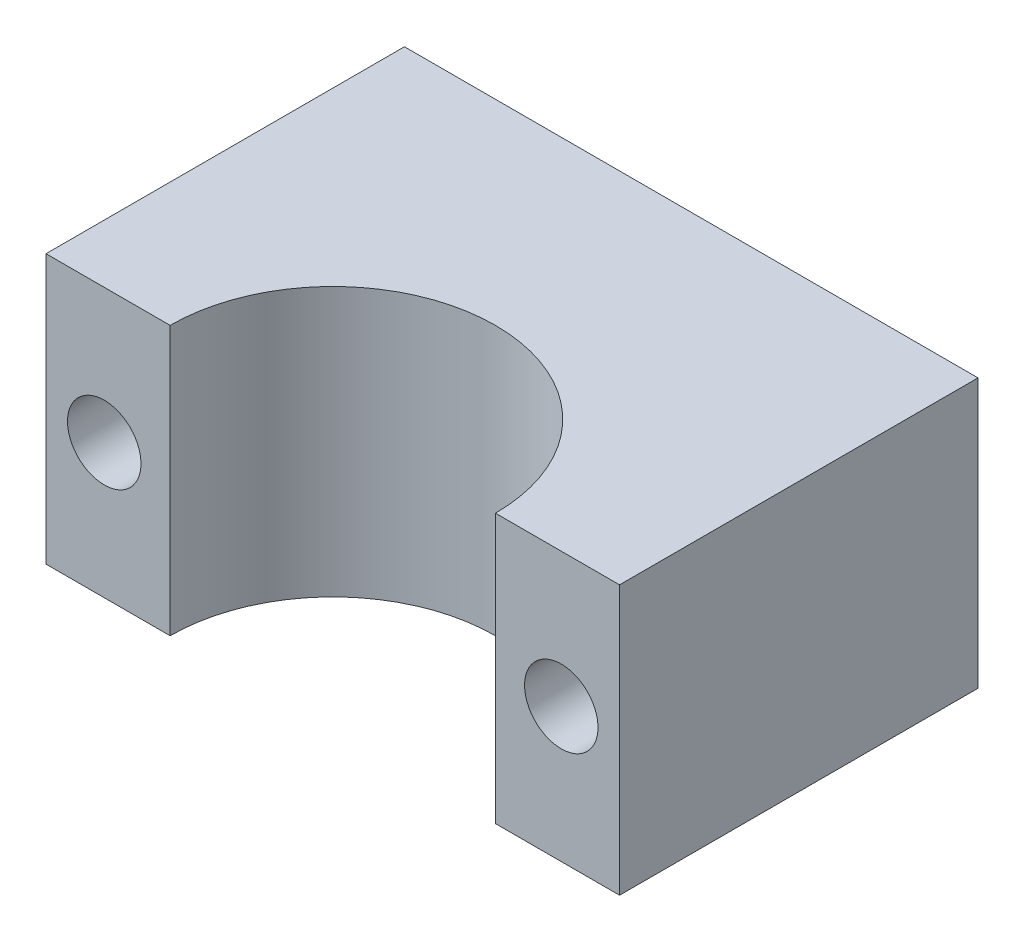
ISO-10303-21;
HEADER;
FILE_DESCRIPTION(('STEP AP214'),'2;1');
FILE_NAME('part.step','',(''),(''),'','','');
FILE_SCHEMA(('AUTOMOTIVE_DESIGN { 1 0 10303 214 1 1 1 1 }'));
ENDSEC;
DATA;
#1=APPLICATION_CONTEXT('core data for automotive mechanical design processes');
#2=APPLICATION_PROTOCOL_DEFINITION('international standard','automotive_design',2000,#1);
#3=PRODUCT_CONTEXT('',#1,'mechanical');
#4=PRODUCT('Part','Part','',(#3));
#5=PRODUCT_RELATED_PRODUCT_CATEGORY('part','',(#4));
#6=PRODUCT_DEFINITION_FORMATION('','',#4);
#7=PRODUCT_DEFINITION_CONTEXT('part definition',#1,'design');
#8=PRODUCT_DEFINITION('design','',#6,#7);
#9=PRODUCT_DEFINITION_SHAPE('','',#8);
#10=(LENGTH_UNIT() NAMED_UNIT(*) SI_UNIT(.MILLI.,.METRE.));
#11=(NAMED_UNIT(*) PLANE_ANGLE_UNIT() SI_UNIT($,.RADIAN.));
#12=(NAMED_UNIT(*) SI_UNIT($,.STERADIAN.) SOLID_ANGLE_UNIT());
#13=UNCERTAINTY_MEASURE_WITH_UNIT(LENGTH_MEASURE(1.E-05),#10,'distance_accuracy_value','');
#14=(GEOMETRIC_REPRESENTATION_CONTEXT(3) GLOBAL_UNCERTAINTY_ASSIGNED_CONTEXT((#13)) GLOBAL_UNIT_ASSIGNED_CONTEXT((#10,
#11,#12)) REPRESENTATION_CONTEXT('',''));
#15=CARTESIAN_POINT('',(0.,0.,0.));
#16=DIRECTION('',(0.,0.,1.));
#17=DIRECTION('',(1.,0.,0.));
#18=AXIS2_PLACEMENT_3D('',#15,#16,#17);
#19=CARTESIAN_POINT('',(-16.,15.,-20.));
#20=DIRECTION('',(0.,0.,1.));
#21=DIRECTION('',(1.,0.,0.));
#22=AXIS2_PLACEMENT_3D('',#19,#20,#21);
#23=PLANE('',#22);
#24=DIRECTION('',(-1.,0.,0.));
#25=VECTOR('',#24,1.);
#26=CARTESIAN_POINT('',(-16.,0.,-20.));
#27=LINE('',#26,#25);
#28=CARTESIAN_POINT('',(16.,0.,-20.));
#29=VERTEX_POINT('',#28);
#30=CARTESIAN_POINT('',(-16.,0.,-20.));
#31=VERTEX_POINT('',#30);
#32=EDGE_CURVE('E167',#29,#31,#27,.T.);
#33=ORIENTED_EDGE('',*,*,#32,.T.);
#34=DIRECTION('',(0.,-1.,0.));
#35=VECTOR('',#34,1.);
#36=CARTESIAN_POINT('',(-16.,15.,-20.));
#37=LINE('',#36,#35);
#38=CARTESIAN_POINT('',(-16.,15.,-20.));
#39=VERTEX_POINT('',#38);
#40=EDGE_CURVE('E148',#39,#31,#37,.T.);
#41=ORIENTED_EDGE('',*,*,#40,.F.);
#42=DIRECTION('',(-1.,0.,0.));
#43=VECTOR('',#42,1.);
#44=CARTESIAN_POINT('',(-16.,15.,-20.));
#45=LINE('',#44,#43);
#46=CARTESIAN_POINT('',(16.,15.,-20.));
#47=VERTEX_POINT('',#46);
#48=EDGE_CURVE('E135',#47,#39,#45,.T.);
#49=ORIENTED_EDGE('',*,*,#48,.F.);
#50=DIRECTION('',(0.,-1.,0.));
#51=VECTOR('',#50,1.);
#52=CARTESIAN_POINT('',(16.,15.,-20.));
#53=LINE('',#52,#51);
#54=EDGE_CURVE('E59',#47,#29,#53,.T.);
#55=ORIENTED_EDGE('',*,*,#54,.T.);
#56=EDGE_LOOP('',(#33,#41,#49,#55));
#57=FACE_BOUND('',#56,.T.);
#58=CARTESIAN_POINT('',(-12.75,7.5,-20.000012));
#59=DIRECTION('',(0.,0.,-1.));
#60=DIRECTION('',(-1.,0.,0.));
#61=AXIS2_PLACEMENT_3D('',#58,#59,#60);
#62=CIRCLE('',#61,2.05);
#63=CARTESIAN_POINT('',(-14.8,7.5,-20.000012));
#64=VERTEX_POINT('',#63);
#65=EDGE_CURVE('E188',#64,#64,#62,.T.);
#66=ORIENTED_EDGE('',*,*,#65,.F.);
#67=EDGE_LOOP('',(#66));
#68=FACE_BOUND('',#67,.T.);
#69=CARTESIAN_POINT('',(12.75,7.5,-20.000012));
#70=DIRECTION('',(0.,0.,-1.));
#71=DIRECTION('',(-1.,0.,0.));
#72=AXIS2_PLACEMENT_3D('',#69,#70,#71);
#73=CIRCLE('',#72,2.05);
#74=CARTESIAN_POINT('',(10.7,7.5,-20.000012));
#75=VERTEX_POINT('',#74);
#76=EDGE_CURVE('E266',#75,#75,#73,.T.);
#77=ORIENTED_EDGE('',*,*,#76,.F.);
#78=EDGE_LOOP('',(#77));
#79=FACE_BOUND('',#78,.T.);
#80=ADVANCED_FACE('F44',(#57,#68,#79),#23,.F.);
#81=CARTESIAN_POINT('',(9.075,15.,0.));
#82=DIRECTION('',(0.,0.,-1.));
#83=DIRECTION('',(-1.,0.,0.));
#84=AXIS2_PLACEMENT_3D('',#81,#82,#83);
#85=PLANE('',#84);
#86=CARTESIAN_POINT('',(12.75,7.5,0.));
#87=DIRECTION('',(0.,0.,-1.));
#88=DIRECTION('',(-1.,0.,0.));
#89=AXIS2_PLACEMENT_3D('',#86,#87,#88);
#90=CIRCLE('',#89,2.05);
#91=CARTESIAN_POINT('',(10.7,7.5,0.));
#92=VERTEX_POINT('',#91);
#93=EDGE_CURVE('E162',#92,#92,#90,.T.);
#94=ORIENTED_EDGE('',*,*,#93,.T.);
#95=EDGE_LOOP('',(#94));
#96=FACE_BOUND('',#95,.T.);
#97=DIRECTION('',(1.,0.,0.));
#98=VECTOR('',#97,1.);
#99=CARTESIAN_POINT('',(9.075,0.,0.));
#100=LINE('',#99,#98);
#101=CARTESIAN_POINT('',(9.075,0.,0.));
#102=VERTEX_POINT('',#101);
#103=CARTESIAN_POINT('',(16.,0.,0.));
#104=VERTEX_POINT('',#103);
#105=EDGE_CURVE('E158',#102,#104,#100,.T.);
#106=ORIENTED_EDGE('',*,*,#105,.T.);
#107=DIRECTION('',(0.,-1.,0.));
#108=VECTOR('',#107,1.);
#109=CARTESIAN_POINT('',(16.,15.,0.));
#110=LINE('',#109,#108);
#111=CARTESIAN_POINT('',(16.,15.,0.));
#112=VERTEX_POINT('',#111);
#113=EDGE_CURVE('E11',#112,#104,#110,.T.);
#114=ORIENTED_EDGE('',*,*,#113,.F.);
#115=DIRECTION('',(1.,0.,0.));
#116=VECTOR('',#115,1.);
#117=CARTESIAN_POINT('',(9.075,15.,0.));
#118=LINE('',#117,#116);
#119=CARTESIAN_POINT('',(9.075,15.,0.));
#120=VERTEX_POINT('',#119);
#121=EDGE_CURVE('E175',#120,#112,#118,.T.);
#122=ORIENTED_EDGE('',*,*,#121,.F.);
#123=DIRECTION('',(0.,-1.,0.));
#124=VECTOR('',#123,1.);
#125=CARTESIAN_POINT('',(9.075,15.,0.));
#126=LINE('',#125,#124);
#127=EDGE_CURVE('E152',#120,#102,#126,.T.);
#128=ORIENTED_EDGE('',*,*,#127,.T.);
#129=EDGE_LOOP('',(#106,#114,#122,#128));
#130=FACE_BOUND('',#129,.T.);
#131=ADVANCED_FACE('F50',(#96,#130),#85,.F.);
#132=CARTESIAN_POINT('',(16.,15.,-20.));
#133=DIRECTION('',(-1.,0.,0.));
#134=DIRECTION('',(0.,0.,1.));
#135=AXIS2_PLACEMENT_3D('',#132,#133,#134);
#136=PLANE('',#135);
#137=DIRECTION('',(0.,0.,-1.));
#138=VECTOR('',#137,1.);
#139=CARTESIAN_POINT('',(16.,0.,-20.));
#140=LINE('',#139,#138);
#141=EDGE_CURVE('E165',#104,#29,#140,.T.);
#142=ORIENTED_EDGE('',*,*,#141,.T.);
#143=ORIENTED_EDGE('',*,*,#54,.F.);
#144=DIRECTION('',(0.,0.,-1.));
#145=VECTOR('',#144,1.);
#146=CARTESIAN_POINT('',(16.,15.,-20.));
#147=LINE('',#146,#145);
#148=EDGE_CURVE('E118',#112,#47,#147,.T.);
#149=ORIENTED_EDGE('',*,*,#148,.F.);
#150=ORIENTED_EDGE('',*,*,#113,.T.);
#151=EDGE_LOOP('',(#142,#143,#149,#150));
#152=FACE_BOUND('',#151,.T.);
#153=ADVANCED_FACE('F201',(#152),#136,.F.);
#154=CARTESIAN_POINT('',(-16.,15.,-20.));
#155=DIRECTION('',(1.,0.,0.));
#156=DIRECTION('',(0.,0.,-1.));
#157=AXIS2_PLACEMENT_3D('',#154,#155,#156);
#158=PLANE('',#157);
#159=DIRECTION('',(0.,0.,1.));
#160=VECTOR('',#159,1.);
#161=CARTESIAN_POINT('',(-16.,0.,-20.));
#162=LINE('',#161,#160);
#163=CARTESIAN_POINT('',(-16.,0.,0.));
#164=VERTEX_POINT('',#163);
#165=EDGE_CURVE('E145',#31,#164,#162,.T.);
#166=ORIENTED_EDGE('',*,*,#165,.T.);
#167=DIRECTION('',(0.,-1.,0.));
#168=VECTOR('',#167,1.);
#169=CARTESIAN_POINT('',(-16.,15.,0.));
#170=LINE('',#169,#168);
#171=CARTESIAN_POINT('',(-16.,15.,0.));
#172=VERTEX_POINT('',#171);
#173=EDGE_CURVE('E143',#172,#164,#170,.T.);
#174=ORIENTED_EDGE('',*,*,#173,.F.);
#175=DIRECTION('',(0.,0.,1.));
#176=VECTOR('',#175,1.);
#177=CARTESIAN_POINT('',(-16.,15.,-20.));
#178=LINE('',#177,#176);
#179=EDGE_CURVE('E129',#39,#172,#178,.T.);
#180=ORIENTED_EDGE('',*,*,#179,.F.);
#181=ORIENTED_EDGE('',*,*,#40,.T.);
#182=EDGE_LOOP('',(#166,#174,#180,#181));
#183=FACE_BOUND('',#182,.T.);
#184=ADVANCED_FACE('F142',(#183),#158,.F.);
#185=CARTESIAN_POINT('',(-16.,15.,0.));
#186=DIRECTION('',(0.,0.,-1.));
#187=DIRECTION('',(-1.,0.,0.));
#188=AXIS2_PLACEMENT_3D('',#185,#186,#187);
#189=PLANE('',#188);
#190=CARTESIAN_POINT('',(-12.75,7.5,0.));
#191=DIRECTION('',(0.,0.,-1.));
#192=DIRECTION('',(-1.,0.,0.));
#193=AXIS2_PLACEMENT_3D('',#190,#191,#192);
#194=CIRCLE('',#193,2.05);
#195=CARTESIAN_POINT('',(-14.8,7.5,0.));
#196=VERTEX_POINT('',#195);
#197=EDGE_CURVE('E275',#196,#196,#194,.T.);
#198=ORIENTED_EDGE('',*,*,#197,.T.);
#199=EDGE_LOOP('',(#198));
#200=FACE_BOUND('',#199,.T.);
#201=DIRECTION('',(1.,0.,0.));
#202=VECTOR('',#201,1.);
#203=CARTESIAN_POINT('',(-16.,0.,0.));
#204=LINE('',#203,#202);
#205=CARTESIAN_POINT('',(-9.075,0.,0.));
#206=VERTEX_POINT('',#205);
#207=EDGE_CURVE('E101',#164,#206,#204,.T.);
#208=ORIENTED_EDGE('',*,*,#207,.T.);
#209=DIRECTION('',(0.,-1.,0.));
#210=VECTOR('',#209,1.);
#211=CARTESIAN_POINT('',(-9.075,15.,0.));
#212=LINE('',#211,#210);
#213=CARTESIAN_POINT('',(-9.075,15.,0.));
#214=VERTEX_POINT('',#213);
#215=EDGE_CURVE('E150',#214,#206,#212,.T.);
#216=ORIENTED_EDGE('',*,*,#215,.F.);
#217=DIRECTION('',(1.,0.,0.));
#218=VECTOR('',#217,1.);
#219=CARTESIAN_POINT('',(-16.,15.,0.));
#220=LINE('',#219,#218);
#221=EDGE_CURVE('E134',#172,#214,#220,.T.);
#222=ORIENTED_EDGE('',*,*,#221,.F.);
#223=ORIENTED_EDGE('',*,*,#173,.T.);
#224=EDGE_LOOP('',(#208,#216,#222,#223));
#225=FACE_BOUND('',#224,.T.);
#226=ADVANCED_FACE('F149',(#200,#225),#189,.F.);
#227=CARTESIAN_POINT('',(0.,15.,0.));
#228=DIRECTION('',(0.,-1.,0.));
#229=DIRECTION('',(0.,0.,-1.));
#230=AXIS2_PLACEMENT_3D('',#227,#228,#229);
#231=CYLINDRICAL_SURFACE('',#230,9.075);
#232=CARTESIAN_POINT('',(0.,0.,0.));
#233=DIRECTION('',(0.,-1.,0.));
#234=DIRECTION('',(0.,0.,1.));
#235=AXIS2_PLACEMENT_3D('',#232,#233,#234);
#236=CIRCLE('',#235,9.075);
#237=EDGE_CURVE('E108',#206,#102,#236,.T.);
#238=ORIENTED_EDGE('',*,*,#237,.T.);
#239=ORIENTED_EDGE('',*,*,#127,.F.);
#240=CARTESIAN_POINT('',(0.,15.,0.));
#241=DIRECTION('',(0.,-1.,0.));
#242=DIRECTION('',(0.,0.,1.));
#243=AXIS2_PLACEMENT_3D('',#240,#241,#242);
#244=CIRCLE('',#243,9.075);
#245=EDGE_CURVE('E72',#214,#120,#244,.T.);
#246=ORIENTED_EDGE('',*,*,#245,.F.);
#247=ORIENTED_EDGE('',*,*,#215,.T.);
#248=EDGE_LOOP('',(#238,#239,#246,#247));
#249=FACE_BOUND('',#248,.T.);
#250=ADVANCED_FACE('F217',(#249),#231,.F.);
#251=CARTESIAN_POINT('',(0.,15.,0.));
#252=DIRECTION('',(0.,1.,0.));
#253=DIRECTION('',(0.,0.,1.));
#254=AXIS2_PLACEMENT_3D('',#251,#252,#253);
#255=PLANE('',#254);
#256=ORIENTED_EDGE('',*,*,#121,.T.);
#257=ORIENTED_EDGE('',*,*,#148,.T.);
#258=ORIENTED_EDGE('',*,*,#48,.T.);
#259=ORIENTED_EDGE('',*,*,#179,.T.);
#260=ORIENTED_EDGE('',*,*,#221,.T.);
#261=ORIENTED_EDGE('',*,*,#245,.T.);
#262=EDGE_LOOP('',(#256,#257,#258,#259,#260,#261));
#263=FACE_BOUND('',#262,.T.);
#264=ADVANCED_FACE('F131',(#263),#255,.T.);
#265=CARTESIAN_POINT('',(0.,0.,0.));
#266=DIRECTION('',(0.,1.,0.));
#267=DIRECTION('',(0.,0.,1.));
#268=AXIS2_PLACEMENT_3D('',#265,#266,#267);
#269=PLANE('',#268);
#270=ORIENTED_EDGE('',*,*,#105,.F.);
#271=ORIENTED_EDGE('',*,*,#237,.F.);
#272=ORIENTED_EDGE('',*,*,#207,.F.);
#273=ORIENTED_EDGE('',*,*,#165,.F.);
#274=ORIENTED_EDGE('',*,*,#32,.F.);
#275=ORIENTED_EDGE('',*,*,#141,.F.);
#276=EDGE_LOOP('',(#270,#271,#272,#273,#274,#275));
#277=FACE_BOUND('',#276,.T.);
#278=ADVANCED_FACE('F214',(#277),#269,.F.);
#279=CARTESIAN_POINT('',(-12.75,7.5,0.));
#280=DIRECTION('',(0.,0.,-1.));
#281=DIRECTION('',(-1.,0.,0.));
#282=AXIS2_PLACEMENT_3D('',#279,#280,#281);
#283=CYLINDRICAL_SURFACE('',#282,2.05);
#284=ORIENTED_EDGE('',*,*,#197,.F.);
#285=EDGE_LOOP('',(#284));
#286=FACE_BOUND('',#285,.T.);
#287=ORIENTED_EDGE('',*,*,#65,.T.);
#288=EDGE_LOOP('',(#287));
#289=FACE_BOUND('',#288,.T.);
#290=ADVANCED_FACE('F228',(#286,#289),#283,.F.);
#291=CARTESIAN_POINT('',(12.75,7.5,0.));
#292=DIRECTION('',(0.,0.,-1.));
#293=DIRECTION('',(-1.,0.,0.));
#294=AXIS2_PLACEMENT_3D('',#291,#292,#293);
#295=CYLINDRICAL_SURFACE('',#294,2.05);
#296=ORIENTED_EDGE('',*,*,#93,.F.);
#297=EDGE_LOOP('',(#296));
#298=FACE_BOUND('',#297,.T.);
#299=ORIENTED_EDGE('',*,*,#76,.T.);
#300=EDGE_LOOP('',(#299));
#301=FACE_BOUND('',#300,.T.);
#302=ADVANCED_FACE('F234',(#298,#301),#295,.F.);
#303=CLOSED_SHELL('',(#80,#131,#153,#184,#226,#250,#264,#278,#290,#302));
#304=MANIFOLD_SOLID_BREP('B2',#303);
#305=ADVANCED_BREP_SHAPE_REPRESENTATION('',(#18,#304),#14);
#306=SHAPE_DEFINITION_REPRESENTATION(#9,#305);
ENDSEC;
END-ISO-10303-21;
